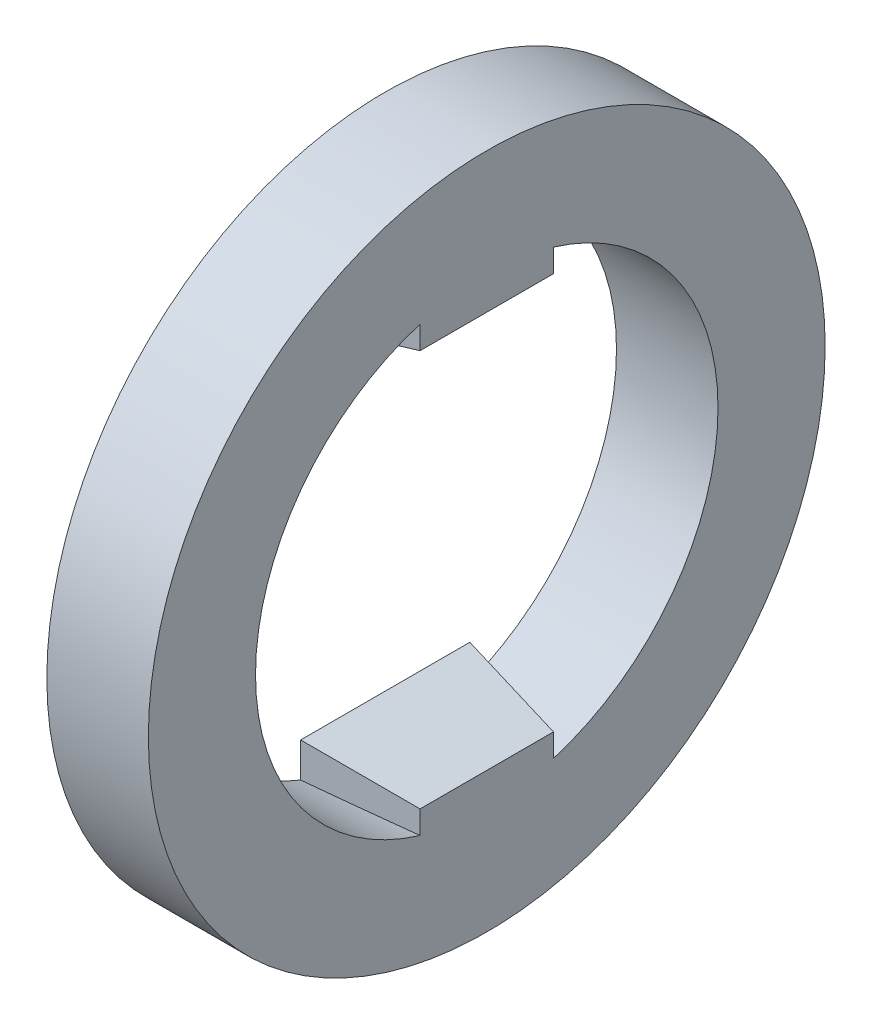
ISO-10303-21;
HEADER;
FILE_DESCRIPTION(('STEP AP214'),'2;1');
FILE_NAME('part.step','',(''),(''),'','','');
FILE_SCHEMA(('AUTOMOTIVE_DESIGN { 1 0 10303 214 1 1 1 1 }'));
ENDSEC;
DATA;
#1=APPLICATION_CONTEXT('core data for automotive mechanical design processes');
#2=APPLICATION_PROTOCOL_DEFINITION('international standard','automotive_design',2000,#1);
#3=PRODUCT_CONTEXT('',#1,'mechanical');
#4=PRODUCT('Part','Part','',(#3));
#5=PRODUCT_RELATED_PRODUCT_CATEGORY('part','',(#4));
#6=PRODUCT_DEFINITION_FORMATION('','',#4);
#7=PRODUCT_DEFINITION_CONTEXT('part definition',#1,'design');
#8=PRODUCT_DEFINITION('design','',#6,#7);
#9=PRODUCT_DEFINITION_SHAPE('','',#8);
#10=(LENGTH_UNIT() NAMED_UNIT(*) SI_UNIT(.MILLI.,.METRE.));
#11=(NAMED_UNIT(*) PLANE_ANGLE_UNIT() SI_UNIT($,.RADIAN.));
#12=(NAMED_UNIT(*) SI_UNIT($,.STERADIAN.) SOLID_ANGLE_UNIT());
#13=UNCERTAINTY_MEASURE_WITH_UNIT(LENGTH_MEASURE(1.E-05),#10,'distance_accuracy_value','');
#14=(GEOMETRIC_REPRESENTATION_CONTEXT(3) GLOBAL_UNCERTAINTY_ASSIGNED_CONTEXT((#13)) GLOBAL_UNIT_ASSIGNED_CONTEXT((#10,
#11,#12)) REPRESENTATION_CONTEXT('',''));
#15=CARTESIAN_POINT('',(0.,0.,0.));
#16=DIRECTION('',(0.,0.,1.));
#17=DIRECTION('',(1.,0.,0.));
#18=AXIS2_PLACEMENT_3D('',#15,#16,#17);
#19=CARTESIAN_POINT('',(0.9,0.,0.));
#20=DIRECTION('',(-1.,0.,0.));
#21=DIRECTION('',(0.,0.,1.));
#22=AXIS2_PLACEMENT_3D('',#19,#20,#21);
#23=CYLINDRICAL_SURFACE('',#22,4.1);
#24=CARTESIAN_POINT('',(-0.9,0.,0.));
#25=DIRECTION('',(1.,0.,0.));
#26=DIRECTION('',(0.,0.,-1.));
#27=AXIS2_PLACEMENT_3D('',#24,#25,#26);
#28=CIRCLE('',#27,4.1);
#29=CARTESIAN_POINT('',(-0.9,3.81575680566778,1.5));
#30=VERTEX_POINT('',#29);
#31=CARTESIAN_POINT('',(-0.9,-3.81575680566778,1.5));
#32=VERTEX_POINT('',#31);
#33=EDGE_CURVE('E178',#30,#32,#28,.T.);
#34=ORIENTED_EDGE('',*,*,#33,.F.);
#35=CARTESIAN_POINT('',(7.60692272942654,0.,0.));
#36=DIRECTION('',(0.173648177666931,0.,0.984807753012208));
#37=DIRECTION('',(-0.984807753012208,0.,0.173648177666931));
#38=AXIS2_PLACEMENT_3D('',#35,#36,#37);
#39=ELLIPSE('',#38,23.6109589808888,4.1);
#40=CARTESIAN_POINT('',(0.9,3.92573944556414,1.18261143472476));
#41=VERTEX_POINT('',#40);
#42=EDGE_CURVE('E11',#30,#41,#39,.F.);
#43=ORIENTED_EDGE('',*,*,#42,.T.);
#44=CARTESIAN_POINT('',(0.9,0.,0.));
#45=DIRECTION('',(1.,0.,0.));
#46=DIRECTION('',(0.,0.,-1.));
#47=AXIS2_PLACEMENT_3D('',#44,#45,#46);
#48=CIRCLE('',#47,4.1);
#49=CARTESIAN_POINT('',(0.9,-3.92573944556414,1.18261143472476));
#50=VERTEX_POINT('',#49);
#51=EDGE_CURVE('E177',#41,#50,#48,.T.);
#52=ORIENTED_EDGE('',*,*,#51,.T.);
#53=CARTESIAN_POINT('',(7.60692272942654,0.,0.));
#54=DIRECTION('',(0.173648177666931,0.,0.984807753012208));
#55=DIRECTION('',(-0.984807753012208,0.,0.173648177666931));
#56=AXIS2_PLACEMENT_3D('',#53,#54,#55);
#57=ELLIPSE('',#56,23.6109589808888,4.1);
#58=EDGE_CURVE('E185',#50,#32,#57,.F.);
#59=ORIENTED_EDGE('',*,*,#58,.T.);
#60=EDGE_LOOP('',(#34,#43,#52,#59));
#61=FACE_BOUND('',#60,.T.);
#62=ADVANCED_FACE('F45',(#61),#23,.F.);
#63=CARTESIAN_POINT('',(0.9,-3.92573944556414,-1.18261143472476));
#64=VERTEX_POINT('',#63);
#65=CARTESIAN_POINT('',(0.9,3.92573944556414,-1.18261143472476));
#66=VERTEX_POINT('',#65);
#67=EDGE_CURVE('E173',#64,#66,#48,.T.);
#68=ORIENTED_EDGE('',*,*,#67,.T.);
#69=CARTESIAN_POINT('',(7.60692272942654,0.,0.));
#70=DIRECTION('',(0.173648177666931,0.,-0.984807753012208));
#71=DIRECTION('',(-0.984807753012208,0.,-0.173648177666931));
#72=AXIS2_PLACEMENT_3D('',#69,#70,#71);
#73=ELLIPSE('',#72,23.6109589808888,4.1);
#74=CARTESIAN_POINT('',(-0.9,3.81575680566778,-1.5));
#75=VERTEX_POINT('',#74);
#76=EDGE_CURVE('E54',#66,#75,#73,.F.);
#77=ORIENTED_EDGE('',*,*,#76,.T.);
#78=CARTESIAN_POINT('',(-0.9,-3.81575680566778,-1.5));
#79=VERTEX_POINT('',#78);
#80=EDGE_CURVE('E125',#79,#75,#28,.T.);
#81=ORIENTED_EDGE('',*,*,#80,.F.);
#82=CARTESIAN_POINT('',(7.60692272942651,0.,0.));
#83=DIRECTION('',(0.173648177666931,0.,-0.984807753012208));
#84=DIRECTION('',(-0.984807753012208,0.,-0.173648177666931));
#85=AXIS2_PLACEMENT_3D('',#82,#83,#84);
#86=ELLIPSE('',#85,23.6109589808888,4.1);
#87=EDGE_CURVE('E193',#79,#64,#86,.F.);
#88=ORIENTED_EDGE('',*,*,#87,.T.);
#89=EDGE_LOOP('',(#68,#77,#81,#88));
#90=FACE_BOUND('',#89,.T.);
#91=ADVANCED_FACE('F200',(#90),#23,.F.);
#92=CARTESIAN_POINT('',(0.9,0.,0.));
#93=DIRECTION('',(1.,0.,0.));
#94=DIRECTION('',(0.,0.,-1.));
#95=AXIS2_PLACEMENT_3D('',#92,#93,#94);
#96=PLANE('',#95);
#97=ORIENTED_EDGE('',*,*,#67,.F.);
#98=DIRECTION('',(0.,-1.,0.));
#99=VECTOR('',#98,1.);
#100=CARTESIAN_POINT('',(0.9,0.,-1.18261143472476));
#101=LINE('',#100,#99);
#102=CARTESIAN_POINT('',(0.9,-3.51738856527524,-1.18261143472476));
#103=VERTEX_POINT('',#102);
#104=EDGE_CURVE('E155',#64,#103,#101,.F.);
#105=ORIENTED_EDGE('',*,*,#104,.T.);
#106=DIRECTION('',(0.,0.,-1.));
#107=VECTOR('',#106,1.);
#108=CARTESIAN_POINT('',(0.9,-3.51738856527524,0.));
#109=LINE('',#108,#107);
#110=CARTESIAN_POINT('',(0.9,-3.51738856527524,1.18261143472476));
#111=VERTEX_POINT('',#110);
#112=EDGE_CURVE('E151',#103,#111,#109,.F.);
#113=ORIENTED_EDGE('',*,*,#112,.T.);
#114=DIRECTION('',(0.,1.,0.));
#115=VECTOR('',#114,1.);
#116=CARTESIAN_POINT('',(0.9,0.,1.18261143472476));
#117=LINE('',#116,#115);
#118=EDGE_CURVE('E147',#111,#50,#117,.F.);
#119=ORIENTED_EDGE('',*,*,#118,.T.);
#120=ORIENTED_EDGE('',*,*,#51,.F.);
#121=DIRECTION('',(0.,1.,0.));
#122=VECTOR('',#121,1.);
#123=CARTESIAN_POINT('',(0.9,0.,1.18261143472476));
#124=LINE('',#123,#122);
#125=CARTESIAN_POINT('',(0.9,3.51738856527524,1.18261143472476));
#126=VERTEX_POINT('',#125);
#127=EDGE_CURVE('E134',#41,#126,#124,.F.);
#128=ORIENTED_EDGE('',*,*,#127,.T.);
#129=DIRECTION('',(0.,0.,1.));
#130=VECTOR('',#129,1.);
#131=CARTESIAN_POINT('',(0.9,3.51738856527524,0.));
#132=LINE('',#131,#130);
#133=CARTESIAN_POINT('',(0.9,3.51738856527524,-1.18261143472476));
#134=VERTEX_POINT('',#133);
#135=EDGE_CURVE('E123',#126,#134,#132,.F.);
#136=ORIENTED_EDGE('',*,*,#135,.T.);
#137=DIRECTION('',(0.,-1.,0.));
#138=VECTOR('',#137,1.);
#139=CARTESIAN_POINT('',(0.9,0.,-1.18261143472476));
#140=LINE('',#139,#138);
#141=EDGE_CURVE('E138',#134,#66,#140,.F.);
#142=ORIENTED_EDGE('',*,*,#141,.T.);
#143=EDGE_LOOP('',(#97,#105,#113,#119,#120,#128,#136,#142));
#144=FACE_BOUND('',#143,.T.);
#145=CARTESIAN_POINT('',(0.9,0.,0.));
#146=DIRECTION('',(1.,0.,0.));
#147=DIRECTION('',(0.,0.,-1.));
#148=AXIS2_PLACEMENT_3D('',#145,#146,#147);
#149=CIRCLE('',#148,6.);
#150=CARTESIAN_POINT('',(0.9,0.,-6.));
#151=VERTEX_POINT('',#150);
#152=EDGE_CURVE('E181',#151,#151,#149,.T.);
#153=ORIENTED_EDGE('',*,*,#152,.T.);
#154=EDGE_LOOP('',(#153));
#155=FACE_BOUND('',#154,.T.);
#156=ADVANCED_FACE('F206',(#144,#155),#96,.T.);
#157=CARTESIAN_POINT('',(-0.9,0.,0.));
#158=DIRECTION('',(1.,0.,0.));
#159=DIRECTION('',(0.,0.,-1.));
#160=AXIS2_PLACEMENT_3D('',#157,#158,#159);
#161=PLANE('',#160);
#162=CARTESIAN_POINT('',(-0.9,0.,0.));
#163=DIRECTION('',(1.,0.,0.));
#164=DIRECTION('',(0.,0.,-1.));
#165=AXIS2_PLACEMENT_3D('',#162,#163,#164);
#166=CIRCLE('',#165,6.);
#167=CARTESIAN_POINT('',(-0.9,0.,-6.));
#168=VERTEX_POINT('',#167);
#169=EDGE_CURVE('E186',#168,#168,#166,.T.);
#170=ORIENTED_EDGE('',*,*,#169,.F.);
#171=EDGE_LOOP('',(#170));
#172=FACE_BOUND('',#171,.T.);
#173=DIRECTION('',(0.,-1.,0.));
#174=VECTOR('',#173,1.);
#175=CARTESIAN_POINT('',(-0.9,0.,1.5));
#176=LINE('',#175,#174);
#177=CARTESIAN_POINT('',(-0.9,3.2,1.5));
#178=VERTEX_POINT('',#177);
#179=EDGE_CURVE('E68',#30,#178,#176,.T.);
#180=ORIENTED_EDGE('',*,*,#179,.F.);
#181=ORIENTED_EDGE('',*,*,#33,.T.);
#182=DIRECTION('',(0.,-1.,0.));
#183=VECTOR('',#182,1.);
#184=CARTESIAN_POINT('',(-0.9,0.,1.5));
#185=LINE('',#184,#183);
#186=CARTESIAN_POINT('',(-0.9,-3.2,1.5));
#187=VERTEX_POINT('',#186);
#188=EDGE_CURVE('E158',#187,#32,#185,.T.);
#189=ORIENTED_EDGE('',*,*,#188,.F.);
#190=DIRECTION('',(0.,0.,1.));
#191=VECTOR('',#190,1.);
#192=CARTESIAN_POINT('',(-0.9,-3.2,0.));
#193=LINE('',#192,#191);
#194=CARTESIAN_POINT('',(-0.9,-3.2,-1.5));
#195=VERTEX_POINT('',#194);
#196=EDGE_CURVE('E168',#195,#187,#193,.T.);
#197=ORIENTED_EDGE('',*,*,#196,.F.);
#198=DIRECTION('',(0.,1.,0.));
#199=VECTOR('',#198,1.);
#200=CARTESIAN_POINT('',(-0.9,0.,-1.49999999999999));
#201=LINE('',#200,#199);
#202=EDGE_CURVE('E61',#79,#195,#201,.T.);
#203=ORIENTED_EDGE('',*,*,#202,.F.);
#204=ORIENTED_EDGE('',*,*,#80,.T.);
#205=DIRECTION('',(0.,1.,0.));
#206=VECTOR('',#205,1.);
#207=CARTESIAN_POINT('',(-0.9,0.,-1.5));
#208=LINE('',#207,#206);
#209=CARTESIAN_POINT('',(-0.9,3.2,-1.5));
#210=VERTEX_POINT('',#209);
#211=EDGE_CURVE('E130',#210,#75,#208,.T.);
#212=ORIENTED_EDGE('',*,*,#211,.F.);
#213=DIRECTION('',(0.,0.,-1.));
#214=VECTOR('',#213,1.);
#215=CARTESIAN_POINT('',(-0.9,3.2,0.));
#216=LINE('',#215,#214);
#217=EDGE_CURVE('E117',#178,#210,#216,.T.);
#218=ORIENTED_EDGE('',*,*,#217,.F.);
#219=EDGE_LOOP('',(#180,#181,#189,#197,#203,#204,#212,#218));
#220=FACE_BOUND('',#219,.T.);
#221=ADVANCED_FACE('F129',(#172,#220),#161,.F.);
#222=CARTESIAN_POINT('',(0.9,0.,0.));
#223=DIRECTION('',(-1.,0.,0.));
#224=DIRECTION('',(0.,0.,1.));
#225=AXIS2_PLACEMENT_3D('',#222,#223,#224);
#226=CYLINDRICAL_SURFACE('',#225,6.);
#227=ORIENTED_EDGE('',*,*,#152,.F.);
#228=EDGE_LOOP('',(#227));
#229=FACE_BOUND('',#228,.T.);
#230=ORIENTED_EDGE('',*,*,#169,.T.);
#231=EDGE_LOOP('',(#230));
#232=FACE_BOUND('',#231,.T.);
#233=ADVANCED_FACE('F47',(#229,#232),#226,.T.);
#234=CARTESIAN_POINT('',(-0.9,0.,-1.49999999999999));
#235=DIRECTION('',(0.173648177666931,0.,-0.984807753012208));
#236=DIRECTION('',(-0.984807753012208,0.,-0.173648177666931));
#237=AXIS2_PLACEMENT_3D('',#234,#235,#236);
#238=PLANE('',#237);
#239=ORIENTED_EDGE('',*,*,#87,.F.);
#240=ORIENTED_EDGE('',*,*,#202,.T.);
#241=DIRECTION('',(-0.970287525247814,0.171087869746036,-0.171087869746036));
#242=VECTOR('',#241,1.);
#243=CARTESIAN_POINT('',(-0.650993361396298,-3.24390658876135,-1.45609341123865));
#244=LINE('',#243,#242);
#245=EDGE_CURVE('E159',#103,#195,#244,.T.);
#246=ORIENTED_EDGE('',*,*,#245,.F.);
#247=ORIENTED_EDGE('',*,*,#104,.F.);
#248=EDGE_LOOP('',(#239,#240,#246,#247));
#249=FACE_BOUND('',#248,.T.);
#250=ADVANCED_FACE('F223',(#249),#238,.T.);
#251=CARTESIAN_POINT('',(-0.9,0.,1.5));
#252=DIRECTION('',(0.173648177666931,0.,0.984807753012208));
#253=DIRECTION('',(0.984807753012208,0.,-0.173648177666931));
#254=AXIS2_PLACEMENT_3D('',#251,#252,#253);
#255=PLANE('',#254);
#256=ORIENTED_EDGE('',*,*,#58,.F.);
#257=ORIENTED_EDGE('',*,*,#118,.F.);
#258=DIRECTION('',(-0.970287525247814,0.171087869746036,0.171087869746036));
#259=VECTOR('',#258,1.);
#260=CARTESIAN_POINT('',(-1.43121416235456,-3.10633261064244,1.59366738935756));
#261=LINE('',#260,#259);
#262=EDGE_CURVE('E152',#111,#187,#261,.T.);
#263=ORIENTED_EDGE('',*,*,#262,.T.);
#264=ORIENTED_EDGE('',*,*,#188,.T.);
#265=EDGE_LOOP('',(#256,#257,#263,#264));
#266=FACE_BOUND('',#265,.T.);
#267=ADVANCED_FACE('F215',(#266),#255,.T.);
#268=CARTESIAN_POINT('',(-0.9,-3.2,0.));
#269=DIRECTION('',(0.173648177666931,0.984807753012208,0.));
#270=DIRECTION('',(-0.984807753012208,0.173648177666931,0.));
#271=AXIS2_PLACEMENT_3D('',#268,#269,#270);
#272=PLANE('',#271);
#273=ORIENTED_EDGE('',*,*,#196,.T.);
#274=ORIENTED_EDGE('',*,*,#262,.F.);
#275=ORIENTED_EDGE('',*,*,#112,.F.);
#276=ORIENTED_EDGE('',*,*,#245,.T.);
#277=EDGE_LOOP('',(#273,#274,#275,#276));
#278=FACE_BOUND('',#277,.T.);
#279=ADVANCED_FACE('F220',(#278),#272,.T.);
#280=CARTESIAN_POINT('',(-0.9,0.,1.5));
#281=DIRECTION('',(0.173648177666931,0.,0.984807753012208));
#282=DIRECTION('',(0.984807753012208,0.,-0.173648177666931));
#283=AXIS2_PLACEMENT_3D('',#280,#281,#282);
#284=PLANE('',#283);
#285=ORIENTED_EDGE('',*,*,#42,.F.);
#286=ORIENTED_EDGE('',*,*,#179,.T.);
#287=DIRECTION('',(-0.970287525247814,-0.171087869746036,0.171087869746036));
#288=VECTOR('',#287,1.);
#289=CARTESIAN_POINT('',(-0.650993361396298,3.24390658876135,1.45609341123865));
#290=LINE('',#289,#288);
#291=EDGE_CURVE('E113',#126,#178,#290,.T.);
#292=ORIENTED_EDGE('',*,*,#291,.F.);
#293=ORIENTED_EDGE('',*,*,#127,.F.);
#294=EDGE_LOOP('',(#285,#286,#292,#293));
#295=FACE_BOUND('',#294,.T.);
#296=ADVANCED_FACE('F112',(#295),#284,.T.);
#297=CARTESIAN_POINT('',(-0.9,0.,-1.5));
#298=DIRECTION('',(0.173648177666931,0.,-0.984807753012208));
#299=DIRECTION('',(-0.984807753012208,0.,-0.173648177666931));
#300=AXIS2_PLACEMENT_3D('',#297,#298,#299);
#301=PLANE('',#300);
#302=ORIENTED_EDGE('',*,*,#76,.F.);
#303=ORIENTED_EDGE('',*,*,#141,.F.);
#304=DIRECTION('',(-0.970287525247814,-0.171087869746036,-0.171087869746036));
#305=VECTOR('',#304,1.);
#306=CARTESIAN_POINT('',(-1.43121416235456,3.10633261064244,-1.59366738935756));
#307=LINE('',#306,#305);
#308=EDGE_CURVE('E126',#134,#210,#307,.T.);
#309=ORIENTED_EDGE('',*,*,#308,.T.);
#310=ORIENTED_EDGE('',*,*,#211,.T.);
#311=EDGE_LOOP('',(#302,#303,#309,#310));
#312=FACE_BOUND('',#311,.T.);
#313=ADVANCED_FACE('F204',(#312),#301,.T.);
#314=CARTESIAN_POINT('',(-0.9,3.2,0.));
#315=DIRECTION('',(0.173648177666931,-0.984807753012208,0.));
#316=DIRECTION('',(0.984807753012208,0.173648177666931,0.));
#317=AXIS2_PLACEMENT_3D('',#314,#315,#316);
#318=PLANE('',#317);
#319=ORIENTED_EDGE('',*,*,#217,.T.);
#320=ORIENTED_EDGE('',*,*,#308,.F.);
#321=ORIENTED_EDGE('',*,*,#135,.F.);
#322=ORIENTED_EDGE('',*,*,#291,.T.);
#323=EDGE_LOOP('',(#319,#320,#321,#322));
#324=FACE_BOUND('',#323,.T.);
#325=ADVANCED_FACE('F120',(#324),#318,.T.);
#326=CLOSED_SHELL('',(#62,#91,#156,#221,#233,#250,#267,#279,#296,#313,#325));
#327=MANIFOLD_SOLID_BREP('B2',#326);
#328=ADVANCED_BREP_SHAPE_REPRESENTATION('',(#18,#327),#14);
#329=SHAPE_DEFINITION_REPRESENTATION(#9,#328);
ENDSEC;
END-ISO-10303-21;
